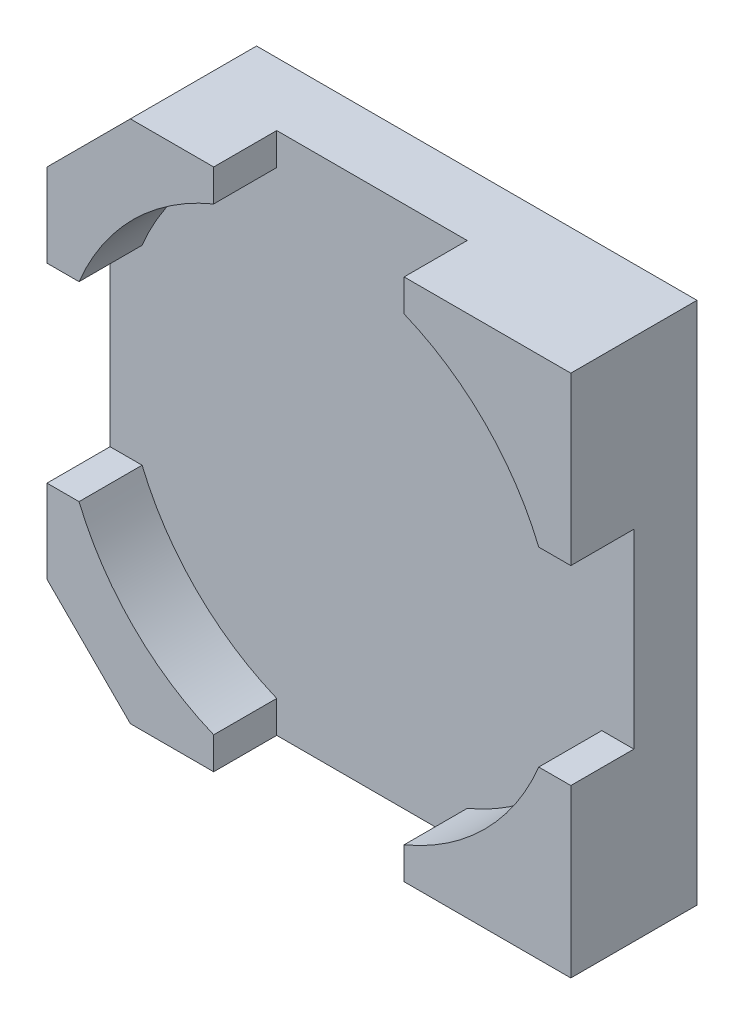
ISO-10303-21;
HEADER;
FILE_DESCRIPTION(('STEP AP214'),'2;1');
FILE_NAME('part.step','',(''),(''),'','','');
FILE_SCHEMA(('AUTOMOTIVE_DESIGN { 1 0 10303 214 1 1 1 1 }'));
ENDSEC;
DATA;
#1=APPLICATION_CONTEXT('core data for automotive mechanical design processes');
#2=APPLICATION_PROTOCOL_DEFINITION('international standard','automotive_design',2000,#1);
#3=PRODUCT_CONTEXT('',#1,'mechanical');
#4=PRODUCT('Part','Part','',(#3));
#5=PRODUCT_RELATED_PRODUCT_CATEGORY('part','',(#4));
#6=PRODUCT_DEFINITION_FORMATION('','',#4);
#7=PRODUCT_DEFINITION_CONTEXT('part definition',#1,'design');
#8=PRODUCT_DEFINITION('design','',#6,#7);
#9=PRODUCT_DEFINITION_SHAPE('','',#8);
#10=(LENGTH_UNIT() NAMED_UNIT(*) SI_UNIT(.MILLI.,.METRE.));
#11=(NAMED_UNIT(*) PLANE_ANGLE_UNIT() SI_UNIT($,.RADIAN.));
#12=(NAMED_UNIT(*) SI_UNIT($,.STERADIAN.) SOLID_ANGLE_UNIT());
#13=UNCERTAINTY_MEASURE_WITH_UNIT(LENGTH_MEASURE(1.E-05),#10,'distance_accuracy_value','');
#14=(GEOMETRIC_REPRESENTATION_CONTEXT(3) GLOBAL_UNCERTAINTY_ASSIGNED_CONTEXT((#13)) GLOBAL_UNIT_ASSIGNED_CONTEXT((#10,
#11,#12)) REPRESENTATION_CONTEXT('',''));
#15=CARTESIAN_POINT('',(0.,0.,0.));
#16=DIRECTION('',(0.,0.,1.));
#17=DIRECTION('',(1.,0.,0.));
#18=AXIS2_PLACEMENT_3D('',#15,#16,#17);
#19=CARTESIAN_POINT('',(0.,0.,1.052));
#20=DIRECTION('',(0.,0.,1.));
#21=DIRECTION('',(1.,0.,0.));
#22=AXIS2_PLACEMENT_3D('',#19,#20,#21);
#23=CYLINDRICAL_SURFACE('',#22,3.945255);
#24=CARTESIAN_POINT('',(0.,0.,1.052));
#25=DIRECTION('',(0.,0.,1.));
#26=DIRECTION('',(1.,0.,0.));
#27=AXIS2_PLACEMENT_3D('',#24,#25,#26);
#28=CIRCLE('',#27,3.945255);
#29=CARTESIAN_POINT('',(3.64493630761459,1.50997361440275,1.052));
#30=VERTEX_POINT('',#29);
#31=CARTESIAN_POINT('',(1.50997361440275,3.64493630761459,1.052));
#32=VERTEX_POINT('',#31);
#33=EDGE_CURVE('E277',#30,#32,#28,.T.);
#34=ORIENTED_EDGE('',*,*,#33,.F.);
#35=DIRECTION('',(0.,0.,1.));
#36=VECTOR('',#35,1.);
#37=CARTESIAN_POINT('',(3.64485075346371,1.51,2.052));
#38=LINE('',#37,#36);
#39=CARTESIAN_POINT('',(3.64485075346371,1.51,2.052));
#40=VERTEX_POINT('',#39);
#41=EDGE_CURVE('E174',#40,#30,#38,.F.);
#42=ORIENTED_EDGE('',*,*,#41,.F.);
#43=CARTESIAN_POINT('',(0.,0.,2.052));
#44=DIRECTION('',(0.,0.,1.));
#45=DIRECTION('',(1.,0.,0.));
#46=AXIS2_PLACEMENT_3D('',#43,#44,#45);
#47=CIRCLE('',#46,3.945255);
#48=CARTESIAN_POINT('',(1.51,3.64485075346371,2.052));
#49=VERTEX_POINT('',#48);
#50=EDGE_CURVE('E217',#49,#40,#47,.F.);
#51=ORIENTED_EDGE('',*,*,#50,.F.);
#52=DIRECTION('',(0.,0.,1.));
#53=VECTOR('',#52,1.);
#54=CARTESIAN_POINT('',(1.51,3.64485075346371,1.052));
#55=LINE('',#54,#53);
#56=EDGE_CURVE('E261',#32,#49,#55,.T.);
#57=ORIENTED_EDGE('',*,*,#56,.F.);
#58=EDGE_LOOP('',(#34,#42,#51,#57));
#59=FACE_BOUND('',#58,.T.);
#60=ADVANCED_FACE('F17',(#59),#23,.F.);
#61=CARTESIAN_POINT('',(0.,0.,1.052));
#62=DIRECTION('',(0.,0.,1.));
#63=DIRECTION('',(1.,0.,0.));
#64=AXIS2_PLACEMENT_3D('',#61,#62,#63);
#65=CYLINDRICAL_SURFACE('',#64,3.945255);
#66=CARTESIAN_POINT('',(0.,0.,1.052));
#67=DIRECTION('',(0.,0.,1.));
#68=DIRECTION('',(1.,0.,0.));
#69=AXIS2_PLACEMENT_3D('',#66,#67,#68);
#70=CIRCLE('',#69,3.945255);
#71=CARTESIAN_POINT('',(1.50997361440275,-3.64493630761459,1.052));
#72=VERTEX_POINT('',#71);
#73=CARTESIAN_POINT('',(3.64493630761459,-1.50997361440275,1.052));
#74=VERTEX_POINT('',#73);
#75=EDGE_CURVE('E169',#72,#74,#70,.T.);
#76=ORIENTED_EDGE('',*,*,#75,.F.);
#77=DIRECTION('',(0.,0.,1.));
#78=VECTOR('',#77,1.);
#79=CARTESIAN_POINT('',(1.51,-3.64485075346371,2.052));
#80=LINE('',#79,#78);
#81=CARTESIAN_POINT('',(1.51,-3.64485075346371,2.052));
#82=VERTEX_POINT('',#81);
#83=EDGE_CURVE('E163',#82,#72,#80,.F.);
#84=ORIENTED_EDGE('',*,*,#83,.F.);
#85=CARTESIAN_POINT('',(0.,0.,2.052));
#86=DIRECTION('',(0.,0.,1.));
#87=DIRECTION('',(1.,0.,0.));
#88=AXIS2_PLACEMENT_3D('',#85,#86,#87);
#89=CIRCLE('',#88,3.945255);
#90=CARTESIAN_POINT('',(3.64485075346371,-1.51,2.052));
#91=VERTEX_POINT('',#90);
#92=EDGE_CURVE('E166',#91,#82,#89,.F.);
#93=ORIENTED_EDGE('',*,*,#92,.F.);
#94=DIRECTION('',(0.,0.,1.));
#95=VECTOR('',#94,1.);
#96=CARTESIAN_POINT('',(3.64485075346371,-1.51,1.052));
#97=LINE('',#96,#95);
#98=EDGE_CURVE('E216',#74,#91,#97,.T.);
#99=ORIENTED_EDGE('',*,*,#98,.F.);
#100=EDGE_LOOP('',(#76,#84,#93,#99));
#101=FACE_BOUND('',#100,.T.);
#102=ADVANCED_FACE('F165',(#101),#65,.F.);
#103=CARTESIAN_POINT('',(0.,0.,1.052));
#104=DIRECTION('',(0.,0.,1.));
#105=DIRECTION('',(1.,0.,0.));
#106=AXIS2_PLACEMENT_3D('',#103,#104,#105);
#107=CYLINDRICAL_SURFACE('',#106,3.945255);
#108=CARTESIAN_POINT('',(0.,0.,1.052));
#109=DIRECTION('',(0.,0.,1.));
#110=DIRECTION('',(1.,0.,0.));
#111=AXIS2_PLACEMENT_3D('',#108,#109,#110);
#112=CIRCLE('',#111,3.945255);
#113=CARTESIAN_POINT('',(-3.64493630761459,-1.50997361440275,1.052));
#114=VERTEX_POINT('',#113);
#115=CARTESIAN_POINT('',(-1.50997361440275,-3.64493630761459,1.052));
#116=VERTEX_POINT('',#115);
#117=EDGE_CURVE('E272',#114,#116,#112,.T.);
#118=ORIENTED_EDGE('',*,*,#117,.F.);
#119=DIRECTION('',(0.,0.,1.));
#120=VECTOR('',#119,1.);
#121=CARTESIAN_POINT('',(-3.64485075346371,-1.51,2.052));
#122=LINE('',#121,#120);
#123=CARTESIAN_POINT('',(-3.64485075346371,-1.51,2.052));
#124=VERTEX_POINT('',#123);
#125=EDGE_CURVE('E173',#124,#114,#122,.F.);
#126=ORIENTED_EDGE('',*,*,#125,.F.);
#127=CARTESIAN_POINT('',(0.,0.,2.052));
#128=DIRECTION('',(0.,0.,1.));
#129=DIRECTION('',(1.,0.,0.));
#130=AXIS2_PLACEMENT_3D('',#127,#128,#129);
#131=CIRCLE('',#130,3.945255);
#132=CARTESIAN_POINT('',(-1.51,-3.64485075346371,2.052));
#133=VERTEX_POINT('',#132);
#134=EDGE_CURVE('E248',#133,#124,#131,.F.);
#135=ORIENTED_EDGE('',*,*,#134,.F.);
#136=DIRECTION('',(0.,0.,1.));
#137=VECTOR('',#136,1.);
#138=CARTESIAN_POINT('',(-1.51,-3.64485075346371,1.052));
#139=LINE('',#138,#137);
#140=EDGE_CURVE('E188',#116,#133,#139,.T.);
#141=ORIENTED_EDGE('',*,*,#140,.F.);
#142=EDGE_LOOP('',(#118,#126,#135,#141));
#143=FACE_BOUND('',#142,.T.);
#144=ADVANCED_FACE('F513',(#143),#107,.F.);
#145=CARTESIAN_POINT('',(0.,0.,1.052));
#146=DIRECTION('',(0.,0.,1.));
#147=DIRECTION('',(1.,0.,0.));
#148=AXIS2_PLACEMENT_3D('',#145,#146,#147);
#149=CYLINDRICAL_SURFACE('',#148,3.945255);
#150=CARTESIAN_POINT('',(0.,0.,1.052));
#151=DIRECTION('',(0.,0.,1.));
#152=DIRECTION('',(1.,0.,0.));
#153=AXIS2_PLACEMENT_3D('',#150,#151,#152);
#154=CIRCLE('',#153,3.945255);
#155=CARTESIAN_POINT('',(-1.50997361440275,3.64493630761459,1.052));
#156=VERTEX_POINT('',#155);
#157=CARTESIAN_POINT('',(-3.64493630761459,1.50997361440275,1.052));
#158=VERTEX_POINT('',#157);
#159=EDGE_CURVE('E268',#156,#158,#154,.T.);
#160=ORIENTED_EDGE('',*,*,#159,.F.);
#161=DIRECTION('',(0.,0.,1.));
#162=VECTOR('',#161,1.);
#163=CARTESIAN_POINT('',(-1.51,3.64485075346371,2.052));
#164=LINE('',#163,#162);
#165=CARTESIAN_POINT('',(-1.51,3.64485075346371,2.052));
#166=VERTEX_POINT('',#165);
#167=EDGE_CURVE('E263',#166,#156,#164,.F.);
#168=ORIENTED_EDGE('',*,*,#167,.F.);
#169=CARTESIAN_POINT('',(0.,0.,2.052));
#170=DIRECTION('',(0.,0.,1.));
#171=DIRECTION('',(1.,0.,0.));
#172=AXIS2_PLACEMENT_3D('',#169,#170,#171);
#173=CIRCLE('',#172,3.945255);
#174=CARTESIAN_POINT('',(-3.64485075346371,1.51,2.052));
#175=VERTEX_POINT('',#174);
#176=EDGE_CURVE('E237',#175,#166,#173,.F.);
#177=ORIENTED_EDGE('',*,*,#176,.F.);
#178=DIRECTION('',(0.,0.,1.));
#179=VECTOR('',#178,1.);
#180=CARTESIAN_POINT('',(-3.64485075346371,1.51,1.052));
#181=LINE('',#180,#179);
#182=EDGE_CURVE('E242',#158,#175,#181,.T.);
#183=ORIENTED_EDGE('',*,*,#182,.F.);
#184=EDGE_LOOP('',(#160,#168,#177,#183));
#185=FACE_BOUND('',#184,.T.);
#186=ADVANCED_FACE('F511',(#185),#149,.F.);
#187=CARTESIAN_POINT('',(-1.51,3.645,1.052));
#188=DIRECTION('',(1.,0.,0.));
#189=DIRECTION('',(0.,0.,-1.));
#190=AXIS2_PLACEMENT_3D('',#187,#188,#189);
#191=PLANE('',#190);
#192=DIRECTION('',(0.,1.,0.));
#193=VECTOR('',#192,1.);
#194=CARTESIAN_POINT('',(-1.51,1.51,2.052));
#195=LINE('',#194,#193);
#196=CARTESIAN_POINT('',(-1.51,4.153,2.052));
#197=VERTEX_POINT('',#196);
#198=EDGE_CURVE('E244',#166,#197,#195,.T.);
#199=ORIENTED_EDGE('',*,*,#198,.F.);
#200=ORIENTED_EDGE('',*,*,#167,.T.);
#201=DIRECTION('',(0.,1.,0.));
#202=VECTOR('',#201,1.);
#203=CARTESIAN_POINT('',(-1.51,-4.153,1.052));
#204=LINE('',#203,#202);
#205=CARTESIAN_POINT('',(-1.51,4.153,1.052));
#206=VERTEX_POINT('',#205);
#207=EDGE_CURVE('E310',#206,#156,#204,.F.);
#208=ORIENTED_EDGE('',*,*,#207,.F.);
#209=DIRECTION('',(0.,0.,1.));
#210=VECTOR('',#209,1.);
#211=CARTESIAN_POINT('',(-1.51,4.153,0.051));
#212=LINE('',#211,#210);
#213=EDGE_CURVE('E383',#197,#206,#212,.F.);
#214=ORIENTED_EDGE('',*,*,#213,.F.);
#215=EDGE_LOOP('',(#199,#200,#208,#214));
#216=FACE_BOUND('',#215,.T.);
#217=ADVANCED_FACE('F509',(#216),#191,.T.);
#218=CARTESIAN_POINT('',(1.51,4.153,1.052));
#219=DIRECTION('',(-1.,0.,0.));
#220=DIRECTION('',(0.,0.,1.));
#221=AXIS2_PLACEMENT_3D('',#218,#219,#220);
#222=PLANE('',#221);
#223=DIRECTION('',(0.,1.,0.));
#224=VECTOR('',#223,1.);
#225=CARTESIAN_POINT('',(1.51,1.51,2.052));
#226=LINE('',#225,#224);
#227=CARTESIAN_POINT('',(1.51,4.153,2.052));
#228=VERTEX_POINT('',#227);
#229=EDGE_CURVE('E260',#228,#49,#226,.F.);
#230=ORIENTED_EDGE('',*,*,#229,.F.);
#231=DIRECTION('',(0.,0.,1.));
#232=VECTOR('',#231,1.);
#233=CARTESIAN_POINT('',(1.51,4.153,0.051));
#234=LINE('',#233,#232);
#235=CARTESIAN_POINT('',(1.51,4.153,1.052));
#236=VERTEX_POINT('',#235);
#237=EDGE_CURVE('E229',#236,#228,#234,.T.);
#238=ORIENTED_EDGE('',*,*,#237,.F.);
#239=DIRECTION('',(0.,1.,0.));
#240=VECTOR('',#239,1.);
#241=CARTESIAN_POINT('',(1.51,-4.153,1.052));
#242=LINE('',#241,#240);
#243=EDGE_CURVE('E307',#32,#236,#242,.T.);
#244=ORIENTED_EDGE('',*,*,#243,.F.);
#245=ORIENTED_EDGE('',*,*,#56,.T.);
#246=EDGE_LOOP('',(#230,#238,#244,#245));
#247=FACE_BOUND('',#246,.T.);
#248=ADVANCED_FACE('F506',(#247),#222,.T.);
#249=CARTESIAN_POINT('',(3.645,1.51,2.052));
#250=DIRECTION('',(0.,0.,1.));
#251=DIRECTION('',(1.,0.,0.));
#252=AXIS2_PLACEMENT_3D('',#249,#250,#251);
#253=PLANE('',#252);
#254=ORIENTED_EDGE('',*,*,#229,.T.);
#255=ORIENTED_EDGE('',*,*,#50,.T.);
#256=DIRECTION('',(1.,0.,0.));
#257=VECTOR('',#256,1.);
#258=CARTESIAN_POINT('',(3.645,1.51,2.052));
#259=LINE('',#258,#257);
#260=CARTESIAN_POINT('',(4.153,1.51,2.052));
#261=VERTEX_POINT('',#260);
#262=EDGE_CURVE('E213',#261,#40,#259,.F.);
#263=ORIENTED_EDGE('',*,*,#262,.F.);
#264=DIRECTION('',(0.,1.,0.));
#265=VECTOR('',#264,1.);
#266=CARTESIAN_POINT('',(4.153,-4.153,2.052));
#267=LINE('',#266,#265);
#268=CARTESIAN_POINT('',(4.153,4.153,2.052));
#269=VERTEX_POINT('',#268);
#270=EDGE_CURVE('E220',#269,#261,#267,.F.);
#271=ORIENTED_EDGE('',*,*,#270,.F.);
#272=DIRECTION('',(1.,0.,0.));
#273=VECTOR('',#272,1.);
#274=CARTESIAN_POINT('',(4.153,4.153,2.052));
#275=LINE('',#274,#273);
#276=EDGE_CURVE('E227',#228,#269,#275,.T.);
#277=ORIENTED_EDGE('',*,*,#276,.F.);
#278=EDGE_LOOP('',(#254,#255,#263,#271,#277));
#279=FACE_BOUND('',#278,.T.);
#280=ADVANCED_FACE('F503',(#279),#253,.T.);
#281=CARTESIAN_POINT('',(3.645,1.51,1.052));
#282=DIRECTION('',(0.,-1.,0.));
#283=DIRECTION('',(0.,0.,-1.));
#284=AXIS2_PLACEMENT_3D('',#281,#282,#283);
#285=PLANE('',#284);
#286=ORIENTED_EDGE('',*,*,#262,.T.);
#287=ORIENTED_EDGE('',*,*,#41,.T.);
#288=DIRECTION('',(1.,0.,0.));
#289=VECTOR('',#288,1.);
#290=CARTESIAN_POINT('',(-1.51,1.51,1.052));
#291=LINE('',#290,#289);
#292=CARTESIAN_POINT('',(4.153,1.51,1.052));
#293=VERTEX_POINT('',#292);
#294=EDGE_CURVE('E297',#293,#30,#291,.F.);
#295=ORIENTED_EDGE('',*,*,#294,.F.);
#296=DIRECTION('',(0.,0.,-1.));
#297=VECTOR('',#296,1.);
#298=CARTESIAN_POINT('',(4.153,1.51,0.051));
#299=LINE('',#298,#297);
#300=EDGE_CURVE('E223',#261,#293,#299,.T.);
#301=ORIENTED_EDGE('',*,*,#300,.F.);
#302=EDGE_LOOP('',(#286,#287,#295,#301));
#303=FACE_BOUND('',#302,.T.);
#304=ADVANCED_FACE('F294',(#303),#285,.T.);
#305=CARTESIAN_POINT('',(4.153,-1.51,1.052));
#306=DIRECTION('',(0.,1.,0.));
#307=DIRECTION('',(0.,0.,1.));
#308=AXIS2_PLACEMENT_3D('',#305,#306,#307);
#309=PLANE('',#308);
#310=DIRECTION('',(1.,0.,0.));
#311=VECTOR('',#310,1.);
#312=CARTESIAN_POINT('',(1.51,-1.51,2.052));
#313=LINE('',#312,#311);
#314=CARTESIAN_POINT('',(4.153,-1.51,2.052));
#315=VERTEX_POINT('',#314);
#316=EDGE_CURVE('E182',#315,#91,#313,.F.);
#317=ORIENTED_EDGE('',*,*,#316,.F.);
#318=DIRECTION('',(0.,0.,-1.));
#319=VECTOR('',#318,1.);
#320=CARTESIAN_POINT('',(4.153,-1.51,0.051));
#321=LINE('',#320,#319);
#322=CARTESIAN_POINT('',(4.153,-1.51,1.052));
#323=VERTEX_POINT('',#322);
#324=EDGE_CURVE('E205',#323,#315,#321,.F.);
#325=ORIENTED_EDGE('',*,*,#324,.F.);
#326=DIRECTION('',(1.,0.,0.));
#327=VECTOR('',#326,1.);
#328=CARTESIAN_POINT('',(-1.51,-1.51,1.052));
#329=LINE('',#328,#327);
#330=EDGE_CURVE('E308',#74,#323,#329,.T.);
#331=ORIENTED_EDGE('',*,*,#330,.F.);
#332=ORIENTED_EDGE('',*,*,#98,.T.);
#333=EDGE_LOOP('',(#317,#325,#331,#332));
#334=FACE_BOUND('',#333,.T.);
#335=ADVANCED_FACE('F425',(#334),#309,.T.);
#336=CARTESIAN_POINT('',(1.51,-3.645,2.052));
#337=DIRECTION('',(0.,0.,1.));
#338=DIRECTION('',(1.,0.,0.));
#339=AXIS2_PLACEMENT_3D('',#336,#337,#338);
#340=PLANE('',#339);
#341=ORIENTED_EDGE('',*,*,#316,.T.);
#342=ORIENTED_EDGE('',*,*,#92,.T.);
#343=DIRECTION('',(0.,1.,0.));
#344=VECTOR('',#343,1.);
#345=CARTESIAN_POINT('',(1.51,-3.645,2.052));
#346=LINE('',#345,#344);
#347=CARTESIAN_POINT('',(1.51,-4.153,2.052));
#348=VERTEX_POINT('',#347);
#349=EDGE_CURVE('E179',#348,#82,#346,.T.);
#350=ORIENTED_EDGE('',*,*,#349,.F.);
#351=DIRECTION('',(1.,0.,0.));
#352=VECTOR('',#351,1.);
#353=CARTESIAN_POINT('',(-2.831,-4.153,2.052));
#354=LINE('',#353,#352);
#355=CARTESIAN_POINT('',(4.153,-4.153,2.052));
#356=VERTEX_POINT('',#355);
#357=EDGE_CURVE('E198',#356,#348,#354,.F.);
#358=ORIENTED_EDGE('',*,*,#357,.F.);
#359=DIRECTION('',(0.,1.,0.));
#360=VECTOR('',#359,1.);
#361=CARTESIAN_POINT('',(4.153,-4.153,2.052));
#362=LINE('',#361,#360);
#363=EDGE_CURVE('E203',#315,#356,#362,.F.);
#364=ORIENTED_EDGE('',*,*,#363,.F.);
#365=EDGE_LOOP('',(#341,#342,#350,#358,#364));
#366=FACE_BOUND('',#365,.T.);
#367=ADVANCED_FACE('F177',(#366),#340,.T.);
#368=CARTESIAN_POINT('',(1.51,-3.645,1.052));
#369=DIRECTION('',(-1.,0.,0.));
#370=DIRECTION('',(0.,0.,1.));
#371=AXIS2_PLACEMENT_3D('',#368,#369,#370);
#372=PLANE('',#371);
#373=ORIENTED_EDGE('',*,*,#349,.T.);
#374=ORIENTED_EDGE('',*,*,#83,.T.);
#375=DIRECTION('',(0.,1.,0.));
#376=VECTOR('',#375,1.);
#377=CARTESIAN_POINT('',(1.51,-4.153,1.052));
#378=LINE('',#377,#376);
#379=CARTESIAN_POINT('',(1.51,-4.153,1.052));
#380=VERTEX_POINT('',#379);
#381=EDGE_CURVE('E312',#380,#72,#378,.T.);
#382=ORIENTED_EDGE('',*,*,#381,.F.);
#383=DIRECTION('',(0.,0.,-1.));
#384=VECTOR('',#383,1.);
#385=CARTESIAN_POINT('',(1.51,-4.153,0.051));
#386=LINE('',#385,#384);
#387=EDGE_CURVE('E186',#348,#380,#386,.T.);
#388=ORIENTED_EDGE('',*,*,#387,.F.);
#389=EDGE_LOOP('',(#373,#374,#382,#388));
#390=FACE_BOUND('',#389,.T.);
#391=ADVANCED_FACE('F184',(#390),#372,.T.);
#392=CARTESIAN_POINT('',(-1.51,-4.153,1.052));
#393=DIRECTION('',(1.,0.,0.));
#394=DIRECTION('',(0.,0.,-1.));
#395=AXIS2_PLACEMENT_3D('',#392,#393,#394);
#396=PLANE('',#395);
#397=DIRECTION('',(0.,1.,0.));
#398=VECTOR('',#397,1.);
#399=CARTESIAN_POINT('',(-1.51,-3.645,2.052));
#400=LINE('',#399,#398);
#401=CARTESIAN_POINT('',(-1.51,-4.153,2.052));
#402=VERTEX_POINT('',#401);
#403=EDGE_CURVE('E251',#402,#133,#400,.T.);
#404=ORIENTED_EDGE('',*,*,#403,.F.);
#405=DIRECTION('',(0.,0.,-1.));
#406=VECTOR('',#405,1.);
#407=CARTESIAN_POINT('',(-1.51,-4.153,0.051));
#408=LINE('',#407,#406);
#409=CARTESIAN_POINT('',(-1.51,-4.153,1.052));
#410=VERTEX_POINT('',#409);
#411=EDGE_CURVE('E336',#410,#402,#408,.F.);
#412=ORIENTED_EDGE('',*,*,#411,.F.);
#413=DIRECTION('',(0.,1.,0.));
#414=VECTOR('',#413,1.);
#415=CARTESIAN_POINT('',(-1.51,-4.153,1.052));
#416=LINE('',#415,#414);
#417=EDGE_CURVE('E401',#116,#410,#416,.F.);
#418=ORIENTED_EDGE('',*,*,#417,.F.);
#419=ORIENTED_EDGE('',*,*,#140,.T.);
#420=EDGE_LOOP('',(#404,#412,#418,#419));
#421=FACE_BOUND('',#420,.T.);
#422=ADVANCED_FACE('F413',(#421),#396,.T.);
#423=CARTESIAN_POINT('',(-1.51,-3.645,2.052));
#424=DIRECTION('',(0.,0.,1.));
#425=DIRECTION('',(1.,0.,0.));
#426=AXIS2_PLACEMENT_3D('',#423,#424,#425);
#427=PLANE('',#426);
#428=ORIENTED_EDGE('',*,*,#403,.T.);
#429=ORIENTED_EDGE('',*,*,#134,.T.);
#430=DIRECTION('',(1.,0.,0.));
#431=VECTOR('',#430,1.);
#432=CARTESIAN_POINT('',(-3.645,-1.51,2.052));
#433=LINE('',#432,#431);
#434=CARTESIAN_POINT('',(-4.153,-1.51,2.052));
#435=VERTEX_POINT('',#434);
#436=EDGE_CURVE('E250',#435,#124,#433,.T.);
#437=ORIENTED_EDGE('',*,*,#436,.F.);
#438=DIRECTION('',(0.,1.,0.));
#439=VECTOR('',#438,1.);
#440=CARTESIAN_POINT('',(-4.153,-3.645,2.052));
#441=LINE('',#440,#439);
#442=CARTESIAN_POINT('',(-4.153,-2.831,2.052));
#443=VERTEX_POINT('',#442);
#444=EDGE_CURVE('E190',#435,#443,#441,.F.);
#445=ORIENTED_EDGE('',*,*,#444,.T.);
#446=DIRECTION('',(0.707106781186548,-0.707106781186548,0.));
#447=VECTOR('',#446,1.);
#448=CARTESIAN_POINT('',(-4.153,-2.831,2.052));
#449=LINE('',#448,#447);
#450=CARTESIAN_POINT('',(-2.831,-4.153,2.052));
#451=VERTEX_POINT('',#450);
#452=EDGE_CURVE('E358',#451,#443,#449,.F.);
#453=ORIENTED_EDGE('',*,*,#452,.F.);
#454=DIRECTION('',(1.,0.,0.));
#455=VECTOR('',#454,1.);
#456=CARTESIAN_POINT('',(-2.831,-4.153,2.052));
#457=LINE('',#456,#455);
#458=EDGE_CURVE('E349',#402,#451,#457,.F.);
#459=ORIENTED_EDGE('',*,*,#458,.F.);
#460=EDGE_LOOP('',(#428,#429,#437,#445,#453,#459));
#461=FACE_BOUND('',#460,.T.);
#462=ADVANCED_FACE('F476',(#461),#427,.T.);
#463=CARTESIAN_POINT('',(-3.645,-1.51,1.052));
#464=DIRECTION('',(0.,1.,0.));
#465=DIRECTION('',(0.,0.,1.));
#466=AXIS2_PLACEMENT_3D('',#463,#464,#465);
#467=PLANE('',#466);
#468=ORIENTED_EDGE('',*,*,#436,.T.);
#469=ORIENTED_EDGE('',*,*,#125,.T.);
#470=DIRECTION('',(1.,0.,0.));
#471=VECTOR('',#470,1.);
#472=CARTESIAN_POINT('',(-1.51,-1.51,1.052));
#473=LINE('',#472,#471);
#474=CARTESIAN_POINT('',(-4.153,-1.51,1.052));
#475=VERTEX_POINT('',#474);
#476=EDGE_CURVE('E380',#475,#114,#473,.T.);
#477=ORIENTED_EDGE('',*,*,#476,.F.);
#478=DIRECTION('',(0.,0.,1.));
#479=VECTOR('',#478,1.);
#480=CARTESIAN_POINT('',(-4.153,-1.51,0.051));
#481=LINE('',#480,#479);
#482=EDGE_CURVE('E364',#435,#475,#481,.F.);
#483=ORIENTED_EDGE('',*,*,#482,.F.);
#484=EDGE_LOOP('',(#468,#469,#477,#483));
#485=FACE_BOUND('',#484,.T.);
#486=ADVANCED_FACE('F546',(#485),#467,.T.);
#487=CARTESIAN_POINT('',(-1.51,-4.153,1.052));
#488=DIRECTION('',(0.,0.,1.));
#489=DIRECTION('',(1.,0.,0.));
#490=AXIS2_PLACEMENT_3D('',#487,#488,#489);
#491=PLANE('',#490);
#492=ORIENTED_EDGE('',*,*,#476,.T.);
#493=ORIENTED_EDGE('',*,*,#117,.T.);
#494=ORIENTED_EDGE('',*,*,#417,.T.);
#495=DIRECTION('',(1.,0.,0.));
#496=VECTOR('',#495,1.);
#497=CARTESIAN_POINT('',(-2.831,-4.153,1.052));
#498=LINE('',#497,#496);
#499=EDGE_CURVE('E333',#380,#410,#498,.F.);
#500=ORIENTED_EDGE('',*,*,#499,.F.);
#501=ORIENTED_EDGE('',*,*,#381,.T.);
#502=ORIENTED_EDGE('',*,*,#75,.T.);
#503=ORIENTED_EDGE('',*,*,#330,.T.);
#504=DIRECTION('',(0.,1.,0.));
#505=VECTOR('',#504,1.);
#506=CARTESIAN_POINT('',(4.153,-4.153,1.052));
#507=LINE('',#506,#505);
#508=EDGE_CURVE('E210',#293,#323,#507,.F.);
#509=ORIENTED_EDGE('',*,*,#508,.F.);
#510=ORIENTED_EDGE('',*,*,#294,.T.);
#511=ORIENTED_EDGE('',*,*,#33,.T.);
#512=ORIENTED_EDGE('',*,*,#243,.T.);
#513=DIRECTION('',(1.,0.,0.));
#514=VECTOR('',#513,1.);
#515=CARTESIAN_POINT('',(4.153,4.153,1.052));
#516=LINE('',#515,#514);
#517=EDGE_CURVE('E234',#206,#236,#516,.T.);
#518=ORIENTED_EDGE('',*,*,#517,.F.);
#519=ORIENTED_EDGE('',*,*,#207,.T.);
#520=ORIENTED_EDGE('',*,*,#159,.T.);
#521=DIRECTION('',(1.,0.,0.));
#522=VECTOR('',#521,1.);
#523=CARTESIAN_POINT('',(-4.153,1.51,1.052));
#524=LINE('',#523,#522);
#525=CARTESIAN_POINT('',(-4.153,1.51,1.052));
#526=VERTEX_POINT('',#525);
#527=EDGE_CURVE('E245',#526,#158,#524,.T.);
#528=ORIENTED_EDGE('',*,*,#527,.F.);
#529=DIRECTION('',(0.,1.,0.));
#530=VECTOR('',#529,1.);
#531=CARTESIAN_POINT('',(-4.153,2.831,1.052));
#532=LINE('',#531,#530);
#533=EDGE_CURVE('E366',#475,#526,#532,.T.);
#534=ORIENTED_EDGE('',*,*,#533,.F.);
#535=EDGE_LOOP('',(#492,#493,#494,#500,#501,#502,#503,#509,#510,#511,#512,#518,#519,#520,#528,#534));
#536=FACE_BOUND('',#535,.T.);
#537=ADVANCED_FACE('F304',(#536),#491,.T.);
#538=CARTESIAN_POINT('',(-4.153,1.51,1.052));
#539=DIRECTION('',(0.,-1.,0.));
#540=DIRECTION('',(0.,0.,-1.));
#541=AXIS2_PLACEMENT_3D('',#538,#539,#540);
#542=PLANE('',#541);
#543=DIRECTION('',(1.,0.,0.));
#544=VECTOR('',#543,1.);
#545=CARTESIAN_POINT('',(-3.645,1.51,2.052));
#546=LINE('',#545,#544);
#547=CARTESIAN_POINT('',(-4.153,1.51,2.052));
#548=VERTEX_POINT('',#547);
#549=EDGE_CURVE('E241',#548,#175,#546,.T.);
#550=ORIENTED_EDGE('',*,*,#549,.F.);
#551=DIRECTION('',(0.,0.,1.));
#552=VECTOR('',#551,1.);
#553=CARTESIAN_POINT('',(-4.153,1.51,0.051));
#554=LINE('',#553,#552);
#555=EDGE_CURVE('E370',#526,#548,#554,.T.);
#556=ORIENTED_EDGE('',*,*,#555,.F.);
#557=ORIENTED_EDGE('',*,*,#527,.T.);
#558=ORIENTED_EDGE('',*,*,#182,.T.);
#559=EDGE_LOOP('',(#550,#556,#557,#558));
#560=FACE_BOUND('',#559,.T.);
#561=ADVANCED_FACE('F447',(#560),#542,.T.);
#562=CARTESIAN_POINT('',(-3.645,1.51,2.052));
#563=DIRECTION('',(0.,0.,1.));
#564=DIRECTION('',(1.,0.,0.));
#565=AXIS2_PLACEMENT_3D('',#562,#563,#564);
#566=PLANE('',#565);
#567=ORIENTED_EDGE('',*,*,#549,.T.);
#568=ORIENTED_EDGE('',*,*,#176,.T.);
#569=ORIENTED_EDGE('',*,*,#198,.T.);
#570=DIRECTION('',(1.,0.,0.));
#571=VECTOR('',#570,1.);
#572=CARTESIAN_POINT('',(4.153,4.153,2.052));
#573=LINE('',#572,#571);
#574=CARTESIAN_POINT('',(-2.831,4.153,2.052));
#575=VERTEX_POINT('',#574);
#576=EDGE_CURVE('E240',#575,#197,#573,.T.);
#577=ORIENTED_EDGE('',*,*,#576,.F.);
#578=DIRECTION('',(-0.707106781186548,-0.707106781186548,0.));
#579=VECTOR('',#578,1.);
#580=CARTESIAN_POINT('',(-2.831,4.153,2.052));
#581=LINE('',#580,#579);
#582=CARTESIAN_POINT('',(-4.153,2.831,2.052));
#583=VERTEX_POINT('',#582);
#584=EDGE_CURVE('E455',#583,#575,#581,.F.);
#585=ORIENTED_EDGE('',*,*,#584,.F.);
#586=DIRECTION('',(0.,1.,0.));
#587=VECTOR('',#586,1.);
#588=CARTESIAN_POINT('',(-4.153,2.831,2.052));
#589=LINE('',#588,#587);
#590=EDGE_CURVE('E437',#548,#583,#589,.T.);
#591=ORIENTED_EDGE('',*,*,#590,.F.);
#592=EDGE_LOOP('',(#567,#568,#569,#577,#585,#591));
#593=FACE_BOUND('',#592,.T.);
#594=ADVANCED_FACE('F453',(#593),#566,.T.);
#595=CARTESIAN_POINT('',(4.153,4.153,0.051));
#596=DIRECTION('',(0.,1.,0.));
#597=DIRECTION('',(0.,0.,1.));
#598=AXIS2_PLACEMENT_3D('',#595,#596,#597);
#599=PLANE('',#598);
#600=ORIENTED_EDGE('',*,*,#276,.T.);
#601=DIRECTION('',(0.,0.,-1.));
#602=VECTOR('',#601,1.);
#603=CARTESIAN_POINT('',(4.153,4.153,0.051));
#604=LINE('',#603,#602);
#605=CARTESIAN_POINT('',(4.153,4.153,0.051));
#606=VERTEX_POINT('',#605);
#607=EDGE_CURVE('E224',#606,#269,#604,.F.);
#608=ORIENTED_EDGE('',*,*,#607,.F.);
#609=DIRECTION('',(-1.,0.,0.));
#610=VECTOR('',#609,1.);
#611=CARTESIAN_POINT('',(-2.831,4.153,0.051));
#612=LINE('',#611,#610);
#613=CARTESIAN_POINT('',(-2.831,4.153,0.051));
#614=VERTEX_POINT('',#613);
#615=EDGE_CURVE('E495',#614,#606,#612,.F.);
#616=ORIENTED_EDGE('',*,*,#615,.F.);
#617=DIRECTION('',(0.,0.,1.));
#618=VECTOR('',#617,1.);
#619=CARTESIAN_POINT('',(-2.831,4.153,0.051));
#620=LINE('',#619,#618);
#621=EDGE_CURVE('E459',#575,#614,#620,.F.);
#622=ORIENTED_EDGE('',*,*,#621,.F.);
#623=ORIENTED_EDGE('',*,*,#576,.T.);
#624=ORIENTED_EDGE('',*,*,#213,.T.);
#625=ORIENTED_EDGE('',*,*,#517,.T.);
#626=ORIENTED_EDGE('',*,*,#237,.T.);
#627=EDGE_LOOP('',(#600,#608,#616,#622,#623,#624,#625,#626));
#628=FACE_BOUND('',#627,.T.);
#629=ADVANCED_FACE('F499',(#628),#599,.T.);
#630=CARTESIAN_POINT('',(4.153,-4.153,0.051));
#631=DIRECTION('',(1.,0.,0.));
#632=DIRECTION('',(0.,0.,-1.));
#633=AXIS2_PLACEMENT_3D('',#630,#631,#632);
#634=PLANE('',#633);
#635=ORIENTED_EDGE('',*,*,#363,.T.);
#636=DIRECTION('',(0.,0.,-1.));
#637=VECTOR('',#636,1.);
#638=CARTESIAN_POINT('',(4.153,-4.153,0.051));
#639=LINE('',#638,#637);
#640=CARTESIAN_POINT('',(4.153,-4.153,0.051));
#641=VERTEX_POINT('',#640);
#642=EDGE_CURVE('E200',#641,#356,#639,.F.);
#643=ORIENTED_EDGE('',*,*,#642,.F.);
#644=DIRECTION('',(0.,1.,0.));
#645=VECTOR('',#644,1.);
#646=CARTESIAN_POINT('',(4.153,4.153,0.051));
#647=LINE('',#646,#645);
#648=EDGE_CURVE('E493',#606,#641,#647,.F.);
#649=ORIENTED_EDGE('',*,*,#648,.F.);
#650=ORIENTED_EDGE('',*,*,#607,.T.);
#651=ORIENTED_EDGE('',*,*,#270,.T.);
#652=ORIENTED_EDGE('',*,*,#300,.T.);
#653=ORIENTED_EDGE('',*,*,#508,.T.);
#654=ORIENTED_EDGE('',*,*,#324,.T.);
#655=EDGE_LOOP('',(#635,#643,#649,#650,#651,#652,#653,#654));
#656=FACE_BOUND('',#655,.T.);
#657=ADVANCED_FACE('F422',(#656),#634,.T.);
#658=CARTESIAN_POINT('',(-2.831,-4.153,0.051));
#659=DIRECTION('',(0.,-1.,0.));
#660=DIRECTION('',(0.,0.,-1.));
#661=AXIS2_PLACEMENT_3D('',#658,#659,#660);
#662=PLANE('',#661);
#663=ORIENTED_EDGE('',*,*,#458,.T.);
#664=DIRECTION('',(0.,0.,1.));
#665=VECTOR('',#664,1.);
#666=CARTESIAN_POINT('',(-2.831,-4.153,0.051));
#667=LINE('',#666,#665);
#668=CARTESIAN_POINT('',(-2.831,-4.153,0.051));
#669=VERTEX_POINT('',#668);
#670=EDGE_CURVE('E351',#669,#451,#667,.T.);
#671=ORIENTED_EDGE('',*,*,#670,.F.);
#672=DIRECTION('',(-1.,0.,0.));
#673=VECTOR('',#672,1.);
#674=CARTESIAN_POINT('',(-2.831,-4.153,0.051));
#675=LINE('',#674,#673);
#676=EDGE_CURVE('E482',#641,#669,#675,.T.);
#677=ORIENTED_EDGE('',*,*,#676,.F.);
#678=ORIENTED_EDGE('',*,*,#642,.T.);
#679=ORIENTED_EDGE('',*,*,#357,.T.);
#680=ORIENTED_EDGE('',*,*,#387,.T.);
#681=ORIENTED_EDGE('',*,*,#499,.T.);
#682=ORIENTED_EDGE('',*,*,#411,.T.);
#683=EDGE_LOOP('',(#663,#671,#677,#678,#679,#680,#681,#682));
#684=FACE_BOUND('',#683,.T.);
#685=ADVANCED_FACE('F417',(#684),#662,.T.);
#686=CARTESIAN_POINT('',(-4.153,-2.831,0.051));
#687=DIRECTION('',(-0.707106781186548,-0.707106781186548,0.));
#688=DIRECTION('',(0.707106781186548,-0.707106781186548,0.));
#689=AXIS2_PLACEMENT_3D('',#686,#687,#688);
#690=PLANE('',#689);
#691=ORIENTED_EDGE('',*,*,#452,.T.);
#692=DIRECTION('',(0.,0.,1.));
#693=VECTOR('',#692,1.);
#694=CARTESIAN_POINT('',(-4.153,-2.831,0.051));
#695=LINE('',#694,#693);
#696=CARTESIAN_POINT('',(-4.153,-2.831,0.051));
#697=VERTEX_POINT('',#696);
#698=EDGE_CURVE('E361',#697,#443,#695,.T.);
#699=ORIENTED_EDGE('',*,*,#698,.F.);
#700=DIRECTION('',(-0.707106781186548,0.707106781186548,0.));
#701=VECTOR('',#700,1.);
#702=CARTESIAN_POINT('',(-2.831,-4.153,0.051));
#703=LINE('',#702,#701);
#704=EDGE_CURVE('E486',#669,#697,#703,.T.);
#705=ORIENTED_EDGE('',*,*,#704,.F.);
#706=ORIENTED_EDGE('',*,*,#670,.T.);
#707=EDGE_LOOP('',(#691,#699,#705,#706));
#708=FACE_BOUND('',#707,.T.);
#709=ADVANCED_FACE('F487',(#708),#690,.T.);
#710=CARTESIAN_POINT('',(-4.153,2.831,0.051));
#711=DIRECTION('',(-1.,0.,0.));
#712=DIRECTION('',(0.,0.,1.));
#713=AXIS2_PLACEMENT_3D('',#710,#711,#712);
#714=PLANE('',#713);
#715=ORIENTED_EDGE('',*,*,#590,.T.);
#716=DIRECTION('',(0.,0.,1.));
#717=VECTOR('',#716,1.);
#718=CARTESIAN_POINT('',(-4.153,2.831,0.051));
#719=LINE('',#718,#717);
#720=CARTESIAN_POINT('',(-4.153,2.831,0.051));
#721=VERTEX_POINT('',#720);
#722=EDGE_CURVE('E35',#721,#583,#719,.T.);
#723=ORIENTED_EDGE('',*,*,#722,.F.);
#724=DIRECTION('',(0.,1.,0.));
#725=VECTOR('',#724,1.);
#726=CARTESIAN_POINT('',(-4.153,4.153,0.051));
#727=LINE('',#726,#725);
#728=EDGE_CURVE('E26',#697,#721,#727,.T.);
#729=ORIENTED_EDGE('',*,*,#728,.F.);
#730=ORIENTED_EDGE('',*,*,#698,.T.);
#731=ORIENTED_EDGE('',*,*,#444,.F.);
#732=ORIENTED_EDGE('',*,*,#482,.T.);
#733=ORIENTED_EDGE('',*,*,#533,.T.);
#734=ORIENTED_EDGE('',*,*,#555,.T.);
#735=EDGE_LOOP('',(#715,#723,#729,#730,#731,#732,#733,#734));
#736=FACE_BOUND('',#735,.T.);
#737=ADVANCED_FACE('F442',(#736),#714,.T.);
#738=CARTESIAN_POINT('',(-2.831,4.153,0.051));
#739=DIRECTION('',(-0.707106781186548,0.707106781186548,0.));
#740=DIRECTION('',(-0.707106781186548,-0.707106781186548,0.));
#741=AXIS2_PLACEMENT_3D('',#738,#739,#740);
#742=PLANE('',#741);
#743=ORIENTED_EDGE('',*,*,#584,.T.);
#744=ORIENTED_EDGE('',*,*,#621,.T.);
#745=DIRECTION('',(0.707106781186548,0.707106781186548,0.));
#746=VECTOR('',#745,1.);
#747=CARTESIAN_POINT('',(-4.153,2.831,0.051));
#748=LINE('',#747,#746);
#749=EDGE_CURVE('E11',#721,#614,#748,.T.);
#750=ORIENTED_EDGE('',*,*,#749,.F.);
#751=ORIENTED_EDGE('',*,*,#722,.T.);
#752=EDGE_LOOP('',(#743,#744,#750,#751));
#753=FACE_BOUND('',#752,.T.);
#754=ADVANCED_FACE('F461',(#753),#742,.T.);
#755=CARTESIAN_POINT('',(-2.831,4.153,0.051));
#756=DIRECTION('',(0.,0.,-1.));
#757=DIRECTION('',(-1.,0.,0.));
#758=AXIS2_PLACEMENT_3D('',#755,#756,#757);
#759=PLANE('',#758);
#760=ORIENTED_EDGE('',*,*,#728,.T.);
#761=ORIENTED_EDGE('',*,*,#749,.T.);
#762=ORIENTED_EDGE('',*,*,#615,.T.);
#763=ORIENTED_EDGE('',*,*,#648,.T.);
#764=ORIENTED_EDGE('',*,*,#676,.T.);
#765=ORIENTED_EDGE('',*,*,#704,.T.);
#766=EDGE_LOOP('',(#760,#761,#762,#763,#764,#765));
#767=FACE_BOUND('',#766,.T.);
#768=ADVANCED_FACE('F490',(#767),#759,.T.);
#769=CLOSED_SHELL('',(#60,#102,#144,#186,#217,#248,#280,#304,#335,#367,#391,#422,#462,#486,#537,
#561,#594,#629,#657,#685,#709,#737,#754,#768));
#770=MANIFOLD_SOLID_BREP('B1',#769);
#771=ADVANCED_BREP_SHAPE_REPRESENTATION('',(#18,#770),#14);
#772=SHAPE_DEFINITION_REPRESENTATION(#9,#771);
ENDSEC;
END-ISO-10303-21;
